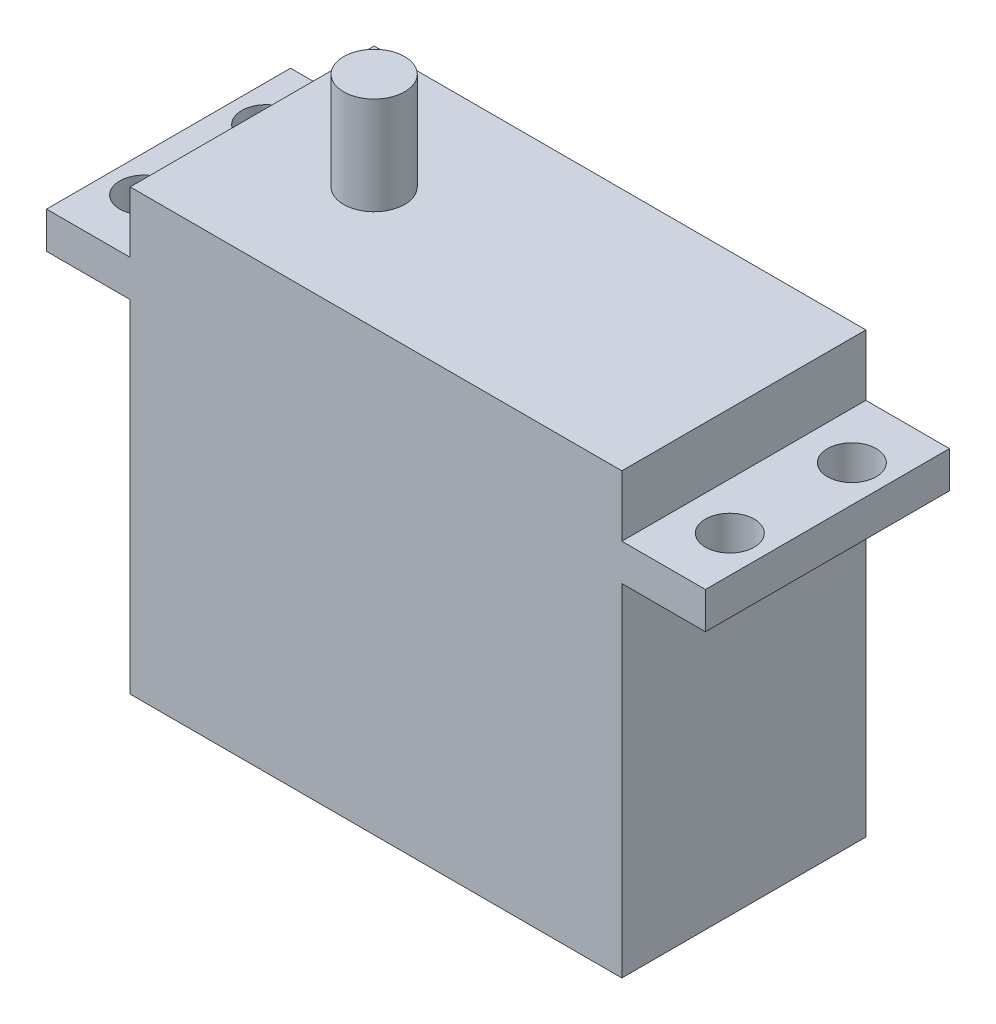
ISO-10303-21;
HEADER;
FILE_DESCRIPTION(('STEP AP214'),'2;1');
FILE_NAME('part.step','',(''),(''),'','','');
FILE_SCHEMA(('AUTOMOTIVE_DESIGN { 1 0 10303 214 1 1 1 1 }'));
ENDSEC;
DATA;
#1=APPLICATION_CONTEXT('core data for automotive mechanical design processes');
#2=APPLICATION_PROTOCOL_DEFINITION('international standard','automotive_design',2000,#1);
#3=PRODUCT_CONTEXT('',#1,'mechanical');
#4=PRODUCT('Part','Part','',(#3));
#5=PRODUCT_RELATED_PRODUCT_CATEGORY('part','',(#4));
#6=PRODUCT_DEFINITION_FORMATION('','',#4);
#7=PRODUCT_DEFINITION_CONTEXT('part definition',#1,'design');
#8=PRODUCT_DEFINITION('design','',#6,#7);
#9=PRODUCT_DEFINITION_SHAPE('','',#8);
#10=(LENGTH_UNIT() NAMED_UNIT(*) SI_UNIT(.MILLI.,.METRE.));
#11=(NAMED_UNIT(*) PLANE_ANGLE_UNIT() SI_UNIT($,.RADIAN.));
#12=(NAMED_UNIT(*) SI_UNIT($,.STERADIAN.) SOLID_ANGLE_UNIT());
#13=UNCERTAINTY_MEASURE_WITH_UNIT(LENGTH_MEASURE(1.E-05),#10,'distance_accuracy_value','');
#14=(GEOMETRIC_REPRESENTATION_CONTEXT(3) GLOBAL_UNCERTAINTY_ASSIGNED_CONTEXT((#13)) GLOBAL_UNIT_ASSIGNED_CONTEXT((#10,
#11,#12)) REPRESENTATION_CONTEXT('',''));
#15=CARTESIAN_POINT('',(0.,0.,0.));
#16=DIRECTION('',(0.,0.,1.));
#17=DIRECTION('',(1.,0.,0.));
#18=AXIS2_PLACEMENT_3D('',#15,#16,#17);
#19=CARTESIAN_POINT('',(0.,31.,0.));
#20=DIRECTION('',(0.,-1.,0.));
#21=DIRECTION('',(0.,0.,-1.));
#22=AXIS2_PLACEMENT_3D('',#19,#20,#21);
#23=PLANE('',#22);
#24=CARTESIAN_POINT('',(-3.85,31.,15.));
#25=DIRECTION('',(0.,1.,0.));
#26=DIRECTION('',(0.,0.,1.));
#27=AXIS2_PLACEMENT_3D('',#24,#25,#26);
#28=CIRCLE('',#27,2.);
#29=CARTESIAN_POINT('',(-3.85,31.,17.));
#30=VERTEX_POINT('',#29);
#31=EDGE_CURVE('E186',#30,#30,#28,.T.);
#32=ORIENTED_EDGE('',*,*,#31,.F.);
#33=EDGE_LOOP('',(#32));
#34=FACE_BOUND('',#33,.T.);
#35=CARTESIAN_POINT('',(-3.85,31.,5.));
#36=DIRECTION('',(0.,1.,0.));
#37=DIRECTION('',(0.,0.,1.));
#38=AXIS2_PLACEMENT_3D('',#35,#36,#37);
#39=CIRCLE('',#38,2.);
#40=CARTESIAN_POINT('',(-3.85,31.,7.));
#41=VERTEX_POINT('',#40);
#42=EDGE_CURVE('E194',#41,#41,#39,.T.);
#43=ORIENTED_EDGE('',*,*,#42,.F.);
#44=EDGE_LOOP('',(#43));
#45=FACE_BOUND('',#44,.T.);
#46=DIRECTION('',(0.,0.,1.));
#47=VECTOR('',#46,1.);
#48=CARTESIAN_POINT('',(0.,31.,0.));
#49=LINE('',#48,#47);
#50=CARTESIAN_POINT('',(0.,31.,0.));
#51=VERTEX_POINT('',#50);
#52=CARTESIAN_POINT('',(0.,31.,20.));
#53=VERTEX_POINT('',#52);
#54=EDGE_CURVE('E11',#51,#53,#49,.T.);
#55=ORIENTED_EDGE('',*,*,#54,.F.);
#56=DIRECTION('',(-1.,0.,0.));
#57=VECTOR('',#56,1.);
#58=CARTESIAN_POINT('',(20.15,31.,0.));
#59=LINE('',#58,#57);
#60=CARTESIAN_POINT('',(-6.85,31.,0.));
#61=VERTEX_POINT('',#60);
#62=EDGE_CURVE('E159',#51,#61,#59,.T.);
#63=ORIENTED_EDGE('',*,*,#62,.T.);
#64=DIRECTION('',(0.,0.,1.));
#65=VECTOR('',#64,1.);
#66=CARTESIAN_POINT('',(-6.85,31.,20.));
#67=LINE('',#66,#65);
#68=CARTESIAN_POINT('',(-6.85,31.,20.));
#69=VERTEX_POINT('',#68);
#70=EDGE_CURVE('E205',#61,#69,#67,.T.);
#71=ORIENTED_EDGE('',*,*,#70,.T.);
#72=DIRECTION('',(1.,0.,0.));
#73=VECTOR('',#72,1.);
#74=CARTESIAN_POINT('',(20.15,31.,20.));
#75=LINE('',#74,#73);
#76=EDGE_CURVE('E69',#69,#53,#75,.T.);
#77=ORIENTED_EDGE('',*,*,#76,.T.);
#78=EDGE_LOOP('',(#55,#63,#71,#77));
#79=FACE_BOUND('',#78,.T.);
#80=ADVANCED_FACE('F45',(#34,#45,#79),#23,.F.);
#81=CARTESIAN_POINT('',(44.15,31.,15.));
#82=DIRECTION('',(0.,1.,0.));
#83=DIRECTION('',(0.,0.,1.));
#84=AXIS2_PLACEMENT_3D('',#81,#82,#83);
#85=CIRCLE('',#84,2.);
#86=CARTESIAN_POINT('',(44.15,31.,17.));
#87=VERTEX_POINT('',#86);
#88=EDGE_CURVE('E170',#87,#87,#85,.T.);
#89=ORIENTED_EDGE('',*,*,#88,.F.);
#90=EDGE_LOOP('',(#89));
#91=FACE_BOUND('',#90,.T.);
#92=CARTESIAN_POINT('',(44.15,31.,5.));
#93=DIRECTION('',(0.,1.,0.));
#94=DIRECTION('',(0.,0.,1.));
#95=AXIS2_PLACEMENT_3D('',#92,#93,#94);
#96=CIRCLE('',#95,2.);
#97=CARTESIAN_POINT('',(44.15,31.,7.));
#98=VERTEX_POINT('',#97);
#99=EDGE_CURVE('E178',#98,#98,#96,.T.);
#100=ORIENTED_EDGE('',*,*,#99,.F.);
#101=EDGE_LOOP('',(#100));
#102=FACE_BOUND('',#101,.T.);
#103=DIRECTION('',(0.,0.,-1.));
#104=VECTOR('',#103,1.);
#105=CARTESIAN_POINT('',(40.3,31.,0.));
#106=LINE('',#105,#104);
#107=CARTESIAN_POINT('',(40.3,31.,20.));
#108=VERTEX_POINT('',#107);
#109=CARTESIAN_POINT('',(40.3,31.,0.));
#110=VERTEX_POINT('',#109);
#111=EDGE_CURVE('E61',#108,#110,#106,.T.);
#112=ORIENTED_EDGE('',*,*,#111,.F.);
#113=CARTESIAN_POINT('',(47.15,31.,20.));
#114=VERTEX_POINT('',#113);
#115=EDGE_CURVE('E208',#108,#114,#75,.T.);
#116=ORIENTED_EDGE('',*,*,#115,.T.);
#117=DIRECTION('',(0.,0.,-1.));
#118=VECTOR('',#117,1.);
#119=CARTESIAN_POINT('',(47.15,31.,0.));
#120=LINE('',#119,#118);
#121=CARTESIAN_POINT('',(47.15,31.,0.));
#122=VERTEX_POINT('',#121);
#123=EDGE_CURVE('E211',#114,#122,#120,.T.);
#124=ORIENTED_EDGE('',*,*,#123,.T.);
#125=EDGE_CURVE('E202',#122,#110,#59,.T.);
#126=ORIENTED_EDGE('',*,*,#125,.T.);
#127=EDGE_LOOP('',(#112,#116,#124,#126));
#128=FACE_BOUND('',#127,.T.);
#129=ADVANCED_FACE('F324',(#91,#102,#128),#23,.F.);
#130=CARTESIAN_POINT('',(40.3,28.,0.));
#131=DIRECTION('',(0.,0.,1.));
#132=DIRECTION('',(1.,0.,0.));
#133=AXIS2_PLACEMENT_3D('',#130,#131,#132);
#134=PLANE('',#133);
#135=DIRECTION('',(0.,-1.,0.));
#136=VECTOR('',#135,1.);
#137=CARTESIAN_POINT('',(40.3,36.,0.));
#138=LINE('',#137,#136);
#139=CARTESIAN_POINT('',(40.3,36.,0.));
#140=VERTEX_POINT('',#139);
#141=EDGE_CURVE('E315',#140,#110,#138,.T.);
#142=ORIENTED_EDGE('',*,*,#141,.T.);
#143=ORIENTED_EDGE('',*,*,#125,.F.);
#144=DIRECTION('',(0.,-1.,0.));
#145=VECTOR('',#144,1.);
#146=CARTESIAN_POINT('',(47.15,31.,0.));
#147=LINE('',#146,#145);
#148=CARTESIAN_POINT('',(47.15,28.,0.));
#149=VERTEX_POINT('',#148);
#150=EDGE_CURVE('E214',#122,#149,#147,.T.);
#151=ORIENTED_EDGE('',*,*,#150,.T.);
#152=DIRECTION('',(-1.,0.,0.));
#153=VECTOR('',#152,1.);
#154=CARTESIAN_POINT('',(20.15,28.,0.));
#155=LINE('',#154,#153);
#156=CARTESIAN_POINT('',(40.3,28.,0.));
#157=VERTEX_POINT('',#156);
#158=EDGE_CURVE('E215',#149,#157,#155,.T.);
#159=ORIENTED_EDGE('',*,*,#158,.T.);
#160=DIRECTION('',(0.,-1.,0.));
#161=VECTOR('',#160,1.);
#162=CARTESIAN_POINT('',(40.3,28.,0.));
#163=LINE('',#162,#161);
#164=CARTESIAN_POINT('',(40.3,0.,0.));
#165=VERTEX_POINT('',#164);
#166=EDGE_CURVE('E257',#157,#165,#163,.T.);
#167=ORIENTED_EDGE('',*,*,#166,.T.);
#168=DIRECTION('',(-1.,0.,0.));
#169=VECTOR('',#168,1.);
#170=CARTESIAN_POINT('',(40.3,0.,0.));
#171=LINE('',#170,#169);
#172=CARTESIAN_POINT('',(0.,0.,0.));
#173=VERTEX_POINT('',#172);
#174=EDGE_CURVE('E247',#165,#173,#171,.T.);
#175=ORIENTED_EDGE('',*,*,#174,.T.);
#176=DIRECTION('',(0.,-1.,0.));
#177=VECTOR('',#176,1.);
#178=CARTESIAN_POINT('',(0.,28.,0.));
#179=LINE('',#178,#177);
#180=CARTESIAN_POINT('',(0.,28.,0.));
#181=VERTEX_POINT('',#180);
#182=EDGE_CURVE('E54',#181,#173,#179,.T.);
#183=ORIENTED_EDGE('',*,*,#182,.F.);
#184=CARTESIAN_POINT('',(-6.85,28.,0.));
#185=VERTEX_POINT('',#184);
#186=EDGE_CURVE('E198',#181,#185,#155,.T.);
#187=ORIENTED_EDGE('',*,*,#186,.T.);
#188=DIRECTION('',(0.,-1.,0.));
#189=VECTOR('',#188,1.);
#190=CARTESIAN_POINT('',(-6.85,31.,0.));
#191=LINE('',#190,#189);
#192=EDGE_CURVE('E243',#61,#185,#191,.T.);
#193=ORIENTED_EDGE('',*,*,#192,.F.);
#194=ORIENTED_EDGE('',*,*,#62,.F.);
#195=DIRECTION('',(0.,-1.,0.));
#196=VECTOR('',#195,1.);
#197=CARTESIAN_POINT('',(0.,36.,0.));
#198=LINE('',#197,#196);
#199=CARTESIAN_POINT('',(0.,36.,0.));
#200=VERTEX_POINT('',#199);
#201=EDGE_CURVE('E138',#200,#51,#198,.T.);
#202=ORIENTED_EDGE('',*,*,#201,.F.);
#203=DIRECTION('',(-1.,0.,0.));
#204=VECTOR('',#203,1.);
#205=CARTESIAN_POINT('',(40.3,36.,0.));
#206=LINE('',#205,#204);
#207=EDGE_CURVE('E145',#140,#200,#206,.T.);
#208=ORIENTED_EDGE('',*,*,#207,.F.);
#209=EDGE_LOOP('',(#142,#143,#151,#159,#167,#175,#183,#187,#193,#194,#202,#208));
#210=FACE_BOUND('',#209,.T.);
#211=ADVANCED_FACE('F47',(#210),#134,.F.);
#212=CARTESIAN_POINT('',(0.,28.,0.));
#213=DIRECTION('',(1.,0.,0.));
#214=DIRECTION('',(0.,0.,-1.));
#215=AXIS2_PLACEMENT_3D('',#212,#213,#214);
#216=PLANE('',#215);
#217=DIRECTION('',(0.,0.,1.));
#218=VECTOR('',#217,1.);
#219=CARTESIAN_POINT('',(0.,0.,0.));
#220=LINE('',#219,#218);
#221=CARTESIAN_POINT('',(0.,0.,20.));
#222=VERTEX_POINT('',#221);
#223=EDGE_CURVE('E261',#173,#222,#220,.T.);
#224=ORIENTED_EDGE('',*,*,#223,.T.);
#225=DIRECTION('',(0.,-1.,0.));
#226=VECTOR('',#225,1.);
#227=CARTESIAN_POINT('',(0.,28.,20.));
#228=LINE('',#227,#226);
#229=CARTESIAN_POINT('',(0.,28.,20.));
#230=VERTEX_POINT('',#229);
#231=EDGE_CURVE('E276',#230,#222,#228,.T.);
#232=ORIENTED_EDGE('',*,*,#231,.F.);
#233=DIRECTION('',(0.,0.,1.));
#234=VECTOR('',#233,1.);
#235=CARTESIAN_POINT('',(0.,28.,0.));
#236=LINE('',#235,#234);
#237=EDGE_CURVE('E248',#181,#230,#236,.T.);
#238=ORIENTED_EDGE('',*,*,#237,.F.);
#239=ORIENTED_EDGE('',*,*,#182,.T.);
#240=EDGE_LOOP('',(#224,#232,#238,#239));
#241=FACE_BOUND('',#240,.T.);
#242=ADVANCED_FACE('F283',(#241),#216,.F.);
#243=CARTESIAN_POINT('',(0.,28.,20.));
#244=DIRECTION('',(0.,0.,-1.));
#245=DIRECTION('',(-1.,0.,0.));
#246=AXIS2_PLACEMENT_3D('',#243,#244,#245);
#247=PLANE('',#246);
#248=DIRECTION('',(0.,-1.,0.));
#249=VECTOR('',#248,1.);
#250=CARTESIAN_POINT('',(40.3,28.,20.));
#251=LINE('',#250,#249);
#252=CARTESIAN_POINT('',(40.3,28.,20.));
#253=VERTEX_POINT('',#252);
#254=CARTESIAN_POINT('',(40.3,0.,20.));
#255=VERTEX_POINT('',#254);
#256=EDGE_CURVE('E272',#253,#255,#251,.T.);
#257=ORIENTED_EDGE('',*,*,#256,.F.);
#258=DIRECTION('',(1.,0.,0.));
#259=VECTOR('',#258,1.);
#260=CARTESIAN_POINT('',(47.15,28.,20.));
#261=LINE('',#260,#259);
#262=CARTESIAN_POINT('',(47.15,28.,20.));
#263=VERTEX_POINT('',#262);
#264=EDGE_CURVE('E223',#253,#263,#261,.T.);
#265=ORIENTED_EDGE('',*,*,#264,.T.);
#266=DIRECTION('',(0.,-1.,0.));
#267=VECTOR('',#266,1.);
#268=CARTESIAN_POINT('',(47.15,31.,20.));
#269=LINE('',#268,#267);
#270=EDGE_CURVE('E235',#114,#263,#269,.T.);
#271=ORIENTED_EDGE('',*,*,#270,.F.);
#272=ORIENTED_EDGE('',*,*,#115,.F.);
#273=DIRECTION('',(0.,-1.,0.));
#274=VECTOR('',#273,1.);
#275=CARTESIAN_POINT('',(40.3,36.,20.));
#276=LINE('',#275,#274);
#277=CARTESIAN_POINT('',(40.3,36.,20.));
#278=VERTEX_POINT('',#277);
#279=EDGE_CURVE('E166',#278,#108,#276,.T.);
#280=ORIENTED_EDGE('',*,*,#279,.F.);
#281=DIRECTION('',(1.,0.,0.));
#282=VECTOR('',#281,1.);
#283=CARTESIAN_POINT('',(0.,36.,20.));
#284=LINE('',#283,#282);
#285=CARTESIAN_POINT('',(0.,36.,20.));
#286=VERTEX_POINT('',#285);
#287=EDGE_CURVE('E144',#286,#278,#284,.T.);
#288=ORIENTED_EDGE('',*,*,#287,.F.);
#289=DIRECTION('',(0.,-1.,0.));
#290=VECTOR('',#289,1.);
#291=CARTESIAN_POINT('',(0.,36.,20.));
#292=LINE('',#291,#290);
#293=EDGE_CURVE('E140',#286,#53,#292,.T.);
#294=ORIENTED_EDGE('',*,*,#293,.T.);
#295=ORIENTED_EDGE('',*,*,#76,.F.);
#296=DIRECTION('',(0.,-1.,0.));
#297=VECTOR('',#296,1.);
#298=CARTESIAN_POINT('',(-6.85,31.,20.));
#299=LINE('',#298,#297);
#300=CARTESIAN_POINT('',(-6.85,28.,20.));
#301=VERTEX_POINT('',#300);
#302=EDGE_CURVE('E239',#69,#301,#299,.T.);
#303=ORIENTED_EDGE('',*,*,#302,.T.);
#304=EDGE_CURVE('E224',#301,#230,#261,.T.);
#305=ORIENTED_EDGE('',*,*,#304,.T.);
#306=ORIENTED_EDGE('',*,*,#231,.T.);
#307=DIRECTION('',(1.,0.,0.));
#308=VECTOR('',#307,1.);
#309=CARTESIAN_POINT('',(0.,0.,20.));
#310=LINE('',#309,#308);
#311=EDGE_CURVE('E264',#222,#255,#310,.T.);
#312=ORIENTED_EDGE('',*,*,#311,.T.);
#313=EDGE_LOOP('',(#257,#265,#271,#272,#280,#288,#294,#295,#303,#305,#306,#312));
#314=FACE_BOUND('',#313,.T.);
#315=ADVANCED_FACE('F291',(#314),#247,.F.);
#316=CARTESIAN_POINT('',(40.3,28.,20.));
#317=DIRECTION('',(-1.,0.,0.));
#318=DIRECTION('',(0.,0.,1.));
#319=AXIS2_PLACEMENT_3D('',#316,#317,#318);
#320=PLANE('',#319);
#321=DIRECTION('',(0.,0.,-1.));
#322=VECTOR('',#321,1.);
#323=CARTESIAN_POINT('',(40.3,0.,20.));
#324=LINE('',#323,#322);
#325=EDGE_CURVE('E253',#255,#165,#324,.T.);
#326=ORIENTED_EDGE('',*,*,#325,.T.);
#327=ORIENTED_EDGE('',*,*,#166,.F.);
#328=DIRECTION('',(0.,0.,-1.));
#329=VECTOR('',#328,1.);
#330=CARTESIAN_POINT('',(40.3,28.,20.));
#331=LINE('',#330,#329);
#332=EDGE_CURVE('E252',#253,#157,#331,.T.);
#333=ORIENTED_EDGE('',*,*,#332,.F.);
#334=ORIENTED_EDGE('',*,*,#256,.T.);
#335=EDGE_LOOP('',(#326,#327,#333,#334));
#336=FACE_BOUND('',#335,.T.);
#337=ADVANCED_FACE('F294',(#336),#320,.F.);
#338=CARTESIAN_POINT('',(0.,0.,0.));
#339=DIRECTION('',(0.,1.,0.));
#340=DIRECTION('',(0.,0.,1.));
#341=AXIS2_PLACEMENT_3D('',#338,#339,#340);
#342=PLANE('',#341);
#343=ORIENTED_EDGE('',*,*,#174,.F.);
#344=ORIENTED_EDGE('',*,*,#325,.F.);
#345=ORIENTED_EDGE('',*,*,#311,.F.);
#346=ORIENTED_EDGE('',*,*,#223,.F.);
#347=EDGE_LOOP('',(#343,#344,#345,#346));
#348=FACE_BOUND('',#347,.T.);
#349=ADVANCED_FACE('F288',(#348),#342,.F.);
#350=CARTESIAN_POINT('',(0.,28.,0.));
#351=DIRECTION('',(0.,-1.,0.));
#352=DIRECTION('',(0.,0.,-1.));
#353=AXIS2_PLACEMENT_3D('',#350,#351,#352);
#354=PLANE('',#353);
#355=CARTESIAN_POINT('',(-3.85,28.,15.));
#356=DIRECTION('',(0.,1.,0.));
#357=DIRECTION('',(0.,0.,1.));
#358=AXIS2_PLACEMENT_3D('',#355,#356,#357);
#359=CIRCLE('',#358,2.);
#360=CARTESIAN_POINT('',(-3.85,28.,17.));
#361=VERTEX_POINT('',#360);
#362=EDGE_CURVE('E182',#361,#361,#359,.T.);
#363=ORIENTED_EDGE('',*,*,#362,.T.);
#364=EDGE_LOOP('',(#363));
#365=FACE_BOUND('',#364,.T.);
#366=CARTESIAN_POINT('',(-3.85,28.,5.));
#367=DIRECTION('',(0.,1.,0.));
#368=DIRECTION('',(0.,0.,1.));
#369=AXIS2_PLACEMENT_3D('',#366,#367,#368);
#370=CIRCLE('',#369,2.);
#371=CARTESIAN_POINT('',(-3.85,28.,7.));
#372=VERTEX_POINT('',#371);
#373=EDGE_CURVE('E190',#372,#372,#370,.T.);
#374=ORIENTED_EDGE('',*,*,#373,.T.);
#375=EDGE_LOOP('',(#374));
#376=FACE_BOUND('',#375,.T.);
#377=ORIENTED_EDGE('',*,*,#186,.F.);
#378=ORIENTED_EDGE('',*,*,#237,.T.);
#379=ORIENTED_EDGE('',*,*,#304,.F.);
#380=DIRECTION('',(0.,0.,1.));
#381=VECTOR('',#380,1.);
#382=CARTESIAN_POINT('',(-6.85,28.,20.));
#383=LINE('',#382,#381);
#384=EDGE_CURVE('E219',#185,#301,#383,.T.);
#385=ORIENTED_EDGE('',*,*,#384,.F.);
#386=EDGE_LOOP('',(#377,#378,#379,#385));
#387=FACE_BOUND('',#386,.T.);
#388=ADVANCED_FACE('F309',(#365,#376,#387),#354,.T.);
#389=CARTESIAN_POINT('',(44.15,28.,5.));
#390=DIRECTION('',(0.,1.,0.));
#391=DIRECTION('',(0.,0.,1.));
#392=AXIS2_PLACEMENT_3D('',#389,#390,#391);
#393=CIRCLE('',#392,2.);
#394=CARTESIAN_POINT('',(44.15,28.,7.));
#395=VERTEX_POINT('',#394);
#396=EDGE_CURVE('E174',#395,#395,#393,.T.);
#397=ORIENTED_EDGE('',*,*,#396,.T.);
#398=EDGE_LOOP('',(#397));
#399=FACE_BOUND('',#398,.T.);
#400=ORIENTED_EDGE('',*,*,#264,.F.);
#401=ORIENTED_EDGE('',*,*,#332,.T.);
#402=ORIENTED_EDGE('',*,*,#158,.F.);
#403=DIRECTION('',(0.,0.,-1.));
#404=VECTOR('',#403,1.);
#405=CARTESIAN_POINT('',(47.15,28.,0.));
#406=LINE('',#405,#404);
#407=EDGE_CURVE('E228',#263,#149,#406,.T.);
#408=ORIENTED_EDGE('',*,*,#407,.F.);
#409=EDGE_LOOP('',(#400,#401,#402,#408));
#410=FACE_BOUND('',#409,.T.);
#411=CARTESIAN_POINT('',(44.15,28.,15.));
#412=DIRECTION('',(0.,1.,0.));
#413=DIRECTION('',(0.,0.,1.));
#414=AXIS2_PLACEMENT_3D('',#411,#412,#413);
#415=CIRCLE('',#414,2.);
#416=CARTESIAN_POINT('',(44.15,28.,17.));
#417=VERTEX_POINT('',#416);
#418=EDGE_CURVE('E164',#417,#417,#415,.T.);
#419=ORIENTED_EDGE('',*,*,#418,.T.);
#420=EDGE_LOOP('',(#419));
#421=FACE_BOUND('',#420,.T.);
#422=ADVANCED_FACE('F298',(#399,#410,#421),#354,.T.);
#423=CARTESIAN_POINT('',(-6.85,31.,20.));
#424=DIRECTION('',(1.,0.,0.));
#425=DIRECTION('',(0.,0.,-1.));
#426=AXIS2_PLACEMENT_3D('',#423,#424,#425);
#427=PLANE('',#426);
#428=ORIENTED_EDGE('',*,*,#384,.T.);
#429=ORIENTED_EDGE('',*,*,#302,.F.);
#430=ORIENTED_EDGE('',*,*,#70,.F.);
#431=ORIENTED_EDGE('',*,*,#192,.T.);
#432=EDGE_LOOP('',(#428,#429,#430,#431));
#433=FACE_BOUND('',#432,.T.);
#434=ADVANCED_FACE('F307',(#433),#427,.F.);
#435=CARTESIAN_POINT('',(47.15,31.,0.));
#436=DIRECTION('',(-1.,0.,0.));
#437=DIRECTION('',(0.,0.,1.));
#438=AXIS2_PLACEMENT_3D('',#435,#436,#437);
#439=PLANE('',#438);
#440=ORIENTED_EDGE('',*,*,#407,.T.);
#441=ORIENTED_EDGE('',*,*,#150,.F.);
#442=ORIENTED_EDGE('',*,*,#123,.F.);
#443=ORIENTED_EDGE('',*,*,#270,.T.);
#444=EDGE_LOOP('',(#440,#441,#442,#443));
#445=FACE_BOUND('',#444,.T.);
#446=ADVANCED_FACE('F327',(#445),#439,.F.);
#447=CARTESIAN_POINT('',(-3.85,31.,5.));
#448=DIRECTION('',(0.,-1.,0.));
#449=DIRECTION('',(0.,0.,-1.));
#450=AXIS2_PLACEMENT_3D('',#447,#448,#449);
#451=CYLINDRICAL_SURFACE('',#450,2.);
#452=ORIENTED_EDGE('',*,*,#42,.T.);
#453=EDGE_LOOP('',(#452));
#454=FACE_BOUND('',#453,.T.);
#455=ORIENTED_EDGE('',*,*,#373,.F.);
#456=EDGE_LOOP('',(#455));
#457=FACE_BOUND('',#456,.T.);
#458=ADVANCED_FACE('F342',(#454,#457),#451,.F.);
#459=CARTESIAN_POINT('',(-3.85,31.,15.));
#460=DIRECTION('',(0.,-1.,0.));
#461=DIRECTION('',(0.,0.,-1.));
#462=AXIS2_PLACEMENT_3D('',#459,#460,#461);
#463=CYLINDRICAL_SURFACE('',#462,2.);
#464=ORIENTED_EDGE('',*,*,#31,.T.);
#465=EDGE_LOOP('',(#464));
#466=FACE_BOUND('',#465,.T.);
#467=ORIENTED_EDGE('',*,*,#362,.F.);
#468=EDGE_LOOP('',(#467));
#469=FACE_BOUND('',#468,.T.);
#470=ADVANCED_FACE('F439',(#466,#469),#463,.F.);
#471=CARTESIAN_POINT('',(44.15,31.,5.));
#472=DIRECTION('',(0.,-1.,0.));
#473=DIRECTION('',(0.,0.,-1.));
#474=AXIS2_PLACEMENT_3D('',#471,#472,#473);
#475=CYLINDRICAL_SURFACE('',#474,2.);
#476=ORIENTED_EDGE('',*,*,#99,.T.);
#477=EDGE_LOOP('',(#476));
#478=FACE_BOUND('',#477,.T.);
#479=ORIENTED_EDGE('',*,*,#396,.F.);
#480=EDGE_LOOP('',(#479));
#481=FACE_BOUND('',#480,.T.);
#482=ADVANCED_FACE('F430',(#478,#481),#475,.F.);
#483=CARTESIAN_POINT('',(44.15,31.,15.));
#484=DIRECTION('',(0.,-1.,0.));
#485=DIRECTION('',(0.,0.,-1.));
#486=AXIS2_PLACEMENT_3D('',#483,#484,#485);
#487=CYLINDRICAL_SURFACE('',#486,2.);
#488=ORIENTED_EDGE('',*,*,#88,.T.);
#489=EDGE_LOOP('',(#488));
#490=FACE_BOUND('',#489,.T.);
#491=ORIENTED_EDGE('',*,*,#418,.F.);
#492=EDGE_LOOP('',(#491));
#493=FACE_BOUND('',#492,.T.);
#494=ADVANCED_FACE('F377',(#490,#493),#487,.F.);
#495=CARTESIAN_POINT('',(0.,36.,0.));
#496=DIRECTION('',(1.,0.,0.));
#497=DIRECTION('',(0.,0.,-1.));
#498=AXIS2_PLACEMENT_3D('',#495,#496,#497);
#499=PLANE('',#498);
#500=ORIENTED_EDGE('',*,*,#201,.T.);
#501=ORIENTED_EDGE('',*,*,#54,.T.);
#502=ORIENTED_EDGE('',*,*,#293,.F.);
#503=DIRECTION('',(0.,0.,1.));
#504=VECTOR('',#503,1.);
#505=CARTESIAN_POINT('',(0.,36.,0.));
#506=LINE('',#505,#504);
#507=EDGE_CURVE('E134',#200,#286,#506,.T.);
#508=ORIENTED_EDGE('',*,*,#507,.F.);
#509=EDGE_LOOP('',(#500,#501,#502,#508));
#510=FACE_BOUND('',#509,.T.);
#511=ADVANCED_FACE('F136',(#510),#499,.F.);
#512=CARTESIAN_POINT('',(40.3,36.,20.));
#513=DIRECTION('',(-1.,0.,0.));
#514=DIRECTION('',(0.,0.,1.));
#515=AXIS2_PLACEMENT_3D('',#512,#513,#514);
#516=PLANE('',#515);
#517=ORIENTED_EDGE('',*,*,#279,.T.);
#518=ORIENTED_EDGE('',*,*,#111,.T.);
#519=ORIENTED_EDGE('',*,*,#141,.F.);
#520=DIRECTION('',(0.,0.,-1.));
#521=VECTOR('',#520,1.);
#522=CARTESIAN_POINT('',(40.3,36.,20.));
#523=LINE('',#522,#521);
#524=EDGE_CURVE('E150',#278,#140,#523,.T.);
#525=ORIENTED_EDGE('',*,*,#524,.F.);
#526=EDGE_LOOP('',(#517,#518,#519,#525));
#527=FACE_BOUND('',#526,.T.);
#528=ADVANCED_FACE('F321',(#527),#516,.F.);
#529=CARTESIAN_POINT('',(0.,36.,0.));
#530=DIRECTION('',(0.,1.,0.));
#531=DIRECTION('',(0.,0.,1.));
#532=AXIS2_PLACEMENT_3D('',#529,#530,#531);
#533=PLANE('',#532);
#534=CARTESIAN_POINT('',(10.,36.,10.));
#535=DIRECTION('',(0.,1.,0.));
#536=DIRECTION('',(0.,0.,1.));
#537=AXIS2_PLACEMENT_3D('',#534,#535,#536);
#538=CIRCLE('',#537,2.5);
#539=CARTESIAN_POINT('',(10.,36.,12.5));
#540=VERTEX_POINT('',#539);
#541=EDGE_CURVE('E539',#540,#540,#538,.T.);
#542=ORIENTED_EDGE('',*,*,#541,.F.);
#543=EDGE_LOOP('',(#542));
#544=FACE_BOUND('',#543,.T.);
#545=ORIENTED_EDGE('',*,*,#207,.T.);
#546=ORIENTED_EDGE('',*,*,#507,.T.);
#547=ORIENTED_EDGE('',*,*,#287,.T.);
#548=ORIENTED_EDGE('',*,*,#524,.T.);
#549=EDGE_LOOP('',(#545,#546,#547,#548));
#550=FACE_BOUND('',#549,.T.);
#551=ADVANCED_FACE('F148',(#544,#550),#533,.T.);
#552=CARTESIAN_POINT('',(10.,44.,10.));
#553=DIRECTION('',(0.,-1.,0.));
#554=DIRECTION('',(0.,0.,-1.));
#555=AXIS2_PLACEMENT_3D('',#552,#553,#554);
#556=CYLINDRICAL_SURFACE('',#555,2.5);
#557=CARTESIAN_POINT('',(10.,44.,10.));
#558=DIRECTION('',(0.,1.,0.));
#559=DIRECTION('',(0.,0.,1.));
#560=AXIS2_PLACEMENT_3D('',#557,#558,#559);
#561=CIRCLE('',#560,2.5);
#562=CARTESIAN_POINT('',(10.,44.,12.5));
#563=VERTEX_POINT('',#562);
#564=EDGE_CURVE('E155',#563,#563,#561,.T.);
#565=ORIENTED_EDGE('',*,*,#564,.F.);
#566=EDGE_LOOP('',(#565));
#567=FACE_BOUND('',#566,.T.);
#568=ORIENTED_EDGE('',*,*,#541,.T.);
#569=EDGE_LOOP('',(#568));
#570=FACE_BOUND('',#569,.T.);
#571=ADVANCED_FACE('F392',(#567,#570),#556,.T.);
#572=CARTESIAN_POINT('',(10.,44.,10.));
#573=DIRECTION('',(0.,1.,0.));
#574=DIRECTION('',(0.,0.,1.));
#575=AXIS2_PLACEMENT_3D('',#572,#573,#574);
#576=PLANE('',#575);
#577=ORIENTED_EDGE('',*,*,#564,.T.);
#578=EDGE_LOOP('',(#577));
#579=FACE_BOUND('',#578,.T.);
#580=ADVANCED_FACE('F401',(#579),#576,.T.);
#581=CLOSED_SHELL('',(#80,#129,#211,#242,#315,#337,#349,#388,#422,#434,#446,#458,#470,#482,#494,
#511,#528,#551,#571,#580));
#582=MANIFOLD_SOLID_BREP('B2',#581);
#583=ADVANCED_BREP_SHAPE_REPRESENTATION('',(#18,#582),#14);
#584=SHAPE_DEFINITION_REPRESENTATION(#9,#583);
ENDSEC;
END-ISO-10303-21;
